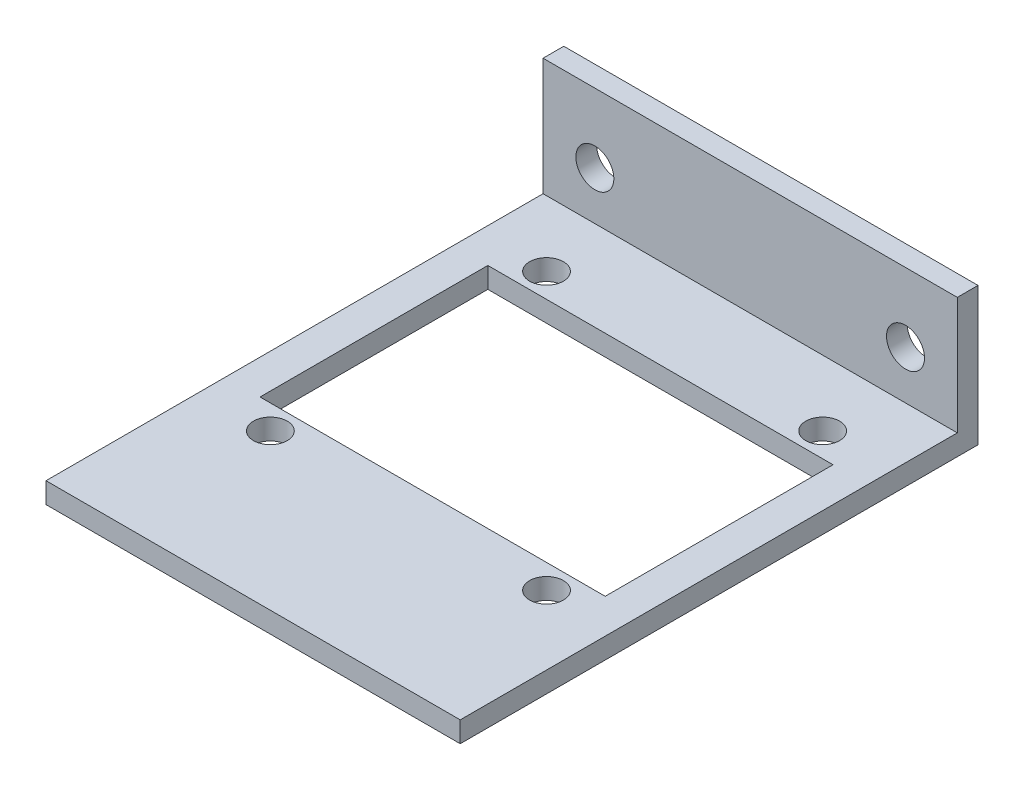
ISO-10303-21;
HEADER;
FILE_DESCRIPTION(('STEP AP214'),'2;1');
FILE_NAME('part.step','',(''),(''),'','','');
FILE_SCHEMA(('AUTOMOTIVE_DESIGN { 1 0 10303 214 1 1 1 1 }'));
ENDSEC;
DATA;
#1=APPLICATION_CONTEXT('core data for automotive mechanical design processes');
#2=APPLICATION_PROTOCOL_DEFINITION('international standard','automotive_design',2000,#1);
#3=PRODUCT_CONTEXT('',#1,'mechanical');
#4=PRODUCT('Part','Part','',(#3));
#5=PRODUCT_RELATED_PRODUCT_CATEGORY('part','',(#4));
#6=PRODUCT_DEFINITION_FORMATION('','',#4);
#7=PRODUCT_DEFINITION_CONTEXT('part definition',#1,'design');
#8=PRODUCT_DEFINITION('design','',#6,#7);
#9=PRODUCT_DEFINITION_SHAPE('','',#8);
#10=(LENGTH_UNIT() NAMED_UNIT(*) SI_UNIT(.MILLI.,.METRE.));
#11=(NAMED_UNIT(*) PLANE_ANGLE_UNIT() SI_UNIT($,.RADIAN.));
#12=(NAMED_UNIT(*) SI_UNIT($,.STERADIAN.) SOLID_ANGLE_UNIT());
#13=UNCERTAINTY_MEASURE_WITH_UNIT(LENGTH_MEASURE(1.E-05),#10,'distance_accuracy_value','');
#14=(GEOMETRIC_REPRESENTATION_CONTEXT(3) GLOBAL_UNCERTAINTY_ASSIGNED_CONTEXT((#13)) GLOBAL_UNIT_ASSIGNED_CONTEXT((#10,
#11,#12)) REPRESENTATION_CONTEXT('',''));
#15=CARTESIAN_POINT('',(0.,0.,0.));
#16=DIRECTION('',(0.,0.,1.));
#17=DIRECTION('',(1.,0.,0.));
#18=AXIS2_PLACEMENT_3D('',#15,#16,#17);
#19=CARTESIAN_POINT('',(-30.,3.,37.5));
#20=DIRECTION('',(0.,0.,-1.));
#21=DIRECTION('',(-1.,0.,0.));
#22=AXIS2_PLACEMENT_3D('',#19,#20,#21);
#23=PLANE('',#22);
#24=DIRECTION('',(1.,0.,0.));
#25=VECTOR('',#24,1.);
#26=CARTESIAN_POINT('',(-30.,0.,37.5));
#27=LINE('',#26,#25);
#28=CARTESIAN_POINT('',(-30.,0.,37.5));
#29=VERTEX_POINT('',#28);
#30=CARTESIAN_POINT('',(30.,0.,37.5));
#31=VERTEX_POINT('',#30);
#32=EDGE_CURVE('E177',#29,#31,#27,.T.);
#33=ORIENTED_EDGE('',*,*,#32,.T.);
#34=DIRECTION('',(0.,-1.,0.));
#35=VECTOR('',#34,1.);
#36=CARTESIAN_POINT('',(30.,3.,37.5));
#37=LINE('',#36,#35);
#38=CARTESIAN_POINT('',(30.,3.,37.5));
#39=VERTEX_POINT('',#38);
#40=EDGE_CURVE('E12',#39,#31,#37,.T.);
#41=ORIENTED_EDGE('',*,*,#40,.F.);
#42=DIRECTION('',(1.,0.,0.));
#43=VECTOR('',#42,1.);
#44=CARTESIAN_POINT('',(-30.,3.,37.5));
#45=LINE('',#44,#43);
#46=CARTESIAN_POINT('',(-30.,3.,37.5));
#47=VERTEX_POINT('',#46);
#48=EDGE_CURVE('E196',#47,#39,#45,.T.);
#49=ORIENTED_EDGE('',*,*,#48,.F.);
#50=DIRECTION('',(0.,-1.,0.));
#51=VECTOR('',#50,1.);
#52=CARTESIAN_POINT('',(-30.,3.,37.5));
#53=LINE('',#52,#51);
#54=EDGE_CURVE('E208',#47,#29,#53,.T.);
#55=ORIENTED_EDGE('',*,*,#54,.T.);
#56=EDGE_LOOP('',(#33,#41,#49,#55));
#57=FACE_BOUND('',#56,.T.);
#58=ADVANCED_FACE('F41',(#57),#23,.F.);
#59=CARTESIAN_POINT('',(30.,3.,37.5));
#60=DIRECTION('',(-1.,0.,0.));
#61=DIRECTION('',(0.,0.,1.));
#62=AXIS2_PLACEMENT_3D('',#59,#60,#61);
#63=PLANE('',#62);
#64=DIRECTION('',(0.,0.,-1.));
#65=VECTOR('',#64,1.);
#66=CARTESIAN_POINT('',(30.,0.,37.5));
#67=LINE('',#66,#65);
#68=CARTESIAN_POINT('',(30.,0.,-37.5));
#69=VERTEX_POINT('',#68);
#70=EDGE_CURVE('E212',#31,#69,#67,.T.);
#71=ORIENTED_EDGE('',*,*,#70,.T.);
#72=DIRECTION('',(0.,-1.,0.));
#73=VECTOR('',#72,1.);
#74=CARTESIAN_POINT('',(30.,3.,-37.5));
#75=LINE('',#74,#73);
#76=CARTESIAN_POINT('',(30.,20.,-37.5));
#77=VERTEX_POINT('',#76);
#78=EDGE_CURVE('E50',#77,#69,#75,.T.);
#79=ORIENTED_EDGE('',*,*,#78,.F.);
#80=DIRECTION('',(0.,0.,-1.));
#81=VECTOR('',#80,1.);
#82=CARTESIAN_POINT('',(30.,20.,-37.5));
#83=LINE('',#82,#81);
#84=CARTESIAN_POINT('',(30.,20.,-34.5));
#85=VERTEX_POINT('',#84);
#86=EDGE_CURVE('E173',#85,#77,#83,.T.);
#87=ORIENTED_EDGE('',*,*,#86,.F.);
#88=DIRECTION('',(0.,-1.,0.));
#89=VECTOR('',#88,1.);
#90=CARTESIAN_POINT('',(30.,100.074953183502,-34.5));
#91=LINE('',#90,#89);
#92=CARTESIAN_POINT('',(30.,3.,-34.5));
#93=VERTEX_POINT('',#92);
#94=EDGE_CURVE('E172',#85,#93,#91,.T.);
#95=ORIENTED_EDGE('',*,*,#94,.T.);
#96=DIRECTION('',(0.,0.,-1.));
#97=VECTOR('',#96,1.);
#98=CARTESIAN_POINT('',(30.,3.,37.5));
#99=LINE('',#98,#97);
#100=EDGE_CURVE('E200',#39,#93,#99,.T.);
#101=ORIENTED_EDGE('',*,*,#100,.F.);
#102=ORIENTED_EDGE('',*,*,#40,.T.);
#103=EDGE_LOOP('',(#71,#79,#87,#95,#101,#102));
#104=FACE_BOUND('',#103,.T.);
#105=ADVANCED_FACE('F300',(#104),#63,.F.);
#106=CARTESIAN_POINT('',(-30.,3.,-37.5));
#107=DIRECTION('',(0.,0.,-1.));
#108=DIRECTION('',(-1.,0.,0.));
#109=AXIS2_PLACEMENT_3D('',#106,#107,#108);
#110=PLANE('',#109);
#111=CARTESIAN_POINT('',(22.5,9.99999999999999,-37.5));
#112=DIRECTION('',(0.,0.,-1.));
#113=DIRECTION('',(-1.,0.,0.));
#114=AXIS2_PLACEMENT_3D('',#111,#112,#113);
#115=CIRCLE('',#114,2.75);
#116=CARTESIAN_POINT('',(19.75,9.99999999999999,-37.5));
#117=VERTEX_POINT('',#116);
#118=EDGE_CURVE('E247',#117,#117,#115,.T.);
#119=ORIENTED_EDGE('',*,*,#118,.F.);
#120=EDGE_LOOP('',(#119));
#121=FACE_BOUND('',#120,.T.);
#122=CARTESIAN_POINT('',(-22.5,9.99999999999999,-37.5));
#123=DIRECTION('',(0.,0.,-1.));
#124=DIRECTION('',(-1.,0.,0.));
#125=AXIS2_PLACEMENT_3D('',#122,#123,#124);
#126=CIRCLE('',#125,2.75);
#127=CARTESIAN_POINT('',(-25.25,9.99999999999999,-37.5));
#128=VERTEX_POINT('',#127);
#129=EDGE_CURVE('E233',#128,#128,#126,.T.);
#130=ORIENTED_EDGE('',*,*,#129,.F.);
#131=EDGE_LOOP('',(#130));
#132=FACE_BOUND('',#131,.T.);
#133=DIRECTION('',(1.,0.,0.));
#134=VECTOR('',#133,1.);
#135=CARTESIAN_POINT('',(-30.,0.,-37.5));
#136=LINE('',#135,#134);
#137=CARTESIAN_POINT('',(-30.,0.,-37.5));
#138=VERTEX_POINT('',#137);
#139=EDGE_CURVE('E216',#138,#69,#136,.T.);
#140=ORIENTED_EDGE('',*,*,#139,.F.);
#141=DIRECTION('',(0.,-1.,0.));
#142=VECTOR('',#141,1.);
#143=CARTESIAN_POINT('',(-30.,3.,-37.5));
#144=LINE('',#143,#142);
#145=CARTESIAN_POINT('',(-30.,20.,-37.5));
#146=VERTEX_POINT('',#145);
#147=EDGE_CURVE('E225',#146,#138,#144,.T.);
#148=ORIENTED_EDGE('',*,*,#147,.F.);
#149=DIRECTION('',(-1.,0.,0.));
#150=VECTOR('',#149,1.);
#151=CARTESIAN_POINT('',(-30.,20.,-37.5));
#152=LINE('',#151,#150);
#153=EDGE_CURVE('E186',#77,#146,#152,.T.);
#154=ORIENTED_EDGE('',*,*,#153,.F.);
#155=ORIENTED_EDGE('',*,*,#78,.T.);
#156=EDGE_LOOP('',(#140,#148,#154,#155));
#157=FACE_BOUND('',#156,.T.);
#158=ADVANCED_FACE('F305',(#121,#132,#157),#110,.T.);
#159=CARTESIAN_POINT('',(-30.,3.,37.5));
#160=DIRECTION('',(-1.,0.,0.));
#161=DIRECTION('',(0.,0.,1.));
#162=AXIS2_PLACEMENT_3D('',#159,#160,#161);
#163=PLANE('',#162);
#164=DIRECTION('',(0.,0.,-1.));
#165=VECTOR('',#164,1.);
#166=CARTESIAN_POINT('',(-30.,0.,37.5));
#167=LINE('',#166,#165);
#168=EDGE_CURVE('E201',#29,#138,#167,.T.);
#169=ORIENTED_EDGE('',*,*,#168,.F.);
#170=ORIENTED_EDGE('',*,*,#54,.F.);
#171=DIRECTION('',(0.,0.,-1.));
#172=VECTOR('',#171,1.);
#173=CARTESIAN_POINT('',(-30.,3.,37.5));
#174=LINE('',#173,#172);
#175=CARTESIAN_POINT('',(-30.,3.,-34.5));
#176=VERTEX_POINT('',#175);
#177=EDGE_CURVE('E204',#47,#176,#174,.T.);
#178=ORIENTED_EDGE('',*,*,#177,.T.);
#179=DIRECTION('',(0.,-1.,0.));
#180=VECTOR('',#179,1.);
#181=CARTESIAN_POINT('',(-30.,100.074953183502,-34.5));
#182=LINE('',#181,#180);
#183=CARTESIAN_POINT('',(-30.,20.,-34.5));
#184=VERTEX_POINT('',#183);
#185=EDGE_CURVE('E136',#184,#176,#182,.T.);
#186=ORIENTED_EDGE('',*,*,#185,.F.);
#187=DIRECTION('',(0.,0.,1.));
#188=VECTOR('',#187,1.);
#189=CARTESIAN_POINT('',(-30.,20.,-37.5));
#190=LINE('',#189,#188);
#191=EDGE_CURVE('E182',#146,#184,#190,.T.);
#192=ORIENTED_EDGE('',*,*,#191,.F.);
#193=ORIENTED_EDGE('',*,*,#147,.T.);
#194=EDGE_LOOP('',(#169,#170,#178,#186,#192,#193));
#195=FACE_BOUND('',#194,.T.);
#196=ADVANCED_FACE('F293',(#195),#163,.T.);
#197=CARTESIAN_POINT('',(0.,3.,0.));
#198=DIRECTION('',(0.,1.,0.));
#199=DIRECTION('',(0.,0.,1.));
#200=AXIS2_PLACEMENT_3D('',#197,#198,#199);
#201=PLANE('',#200);
#202=CARTESIAN_POINT('',(-20.,3.,15.));
#203=DIRECTION('',(0.,1.,0.));
#204=DIRECTION('',(0.,0.,1.));
#205=AXIS2_PLACEMENT_3D('',#202,#203,#204);
#206=CIRCLE('',#205,2.45);
#207=CARTESIAN_POINT('',(-20.,3.,17.45));
#208=VERTEX_POINT('',#207);
#209=EDGE_CURVE('E232',#208,#208,#206,.T.);
#210=ORIENTED_EDGE('',*,*,#209,.F.);
#211=EDGE_LOOP('',(#210));
#212=FACE_BOUND('',#211,.T.);
#213=CARTESIAN_POINT('',(20.,3.,15.));
#214=DIRECTION('',(0.,1.,0.));
#215=DIRECTION('',(0.,0.,1.));
#216=AXIS2_PLACEMENT_3D('',#213,#214,#215);
#217=CIRCLE('',#216,2.45);
#218=CARTESIAN_POINT('',(20.,3.,17.45));
#219=VERTEX_POINT('',#218);
#220=EDGE_CURVE('E260',#219,#219,#217,.T.);
#221=ORIENTED_EDGE('',*,*,#220,.F.);
#222=EDGE_LOOP('',(#221));
#223=FACE_BOUND('',#222,.T.);
#224=CARTESIAN_POINT('',(20.,3.,-25.));
#225=DIRECTION('',(0.,1.,0.));
#226=DIRECTION('',(0.,0.,1.));
#227=AXIS2_PLACEMENT_3D('',#224,#225,#226);
#228=CIRCLE('',#227,2.45);
#229=CARTESIAN_POINT('',(20.,3.,-22.55));
#230=VERTEX_POINT('',#229);
#231=EDGE_CURVE('E250',#230,#230,#228,.T.);
#232=ORIENTED_EDGE('',*,*,#231,.F.);
#233=EDGE_LOOP('',(#232));
#234=FACE_BOUND('',#233,.T.);
#235=CARTESIAN_POINT('',(-20.,3.,-25.));
#236=DIRECTION('',(0.,1.,0.));
#237=DIRECTION('',(0.,0.,1.));
#238=AXIS2_PLACEMENT_3D('',#235,#236,#237);
#239=CIRCLE('',#238,2.45);
#240=CARTESIAN_POINT('',(-20.,3.,-22.55));
#241=VERTEX_POINT('',#240);
#242=EDGE_CURVE('E259',#241,#241,#239,.T.);
#243=ORIENTED_EDGE('',*,*,#242,.F.);
#244=EDGE_LOOP('',(#243));
#245=FACE_BOUND('',#244,.T.);
#246=DIRECTION('',(0.,0.,-1.));
#247=VECTOR('',#246,1.);
#248=CARTESIAN_POINT('',(25.,3.,-21.5));
#249=LINE('',#248,#247);
#250=CARTESIAN_POINT('',(25.,3.,11.5));
#251=VERTEX_POINT('',#250);
#252=CARTESIAN_POINT('',(25.,3.,-21.5));
#253=VERTEX_POINT('',#252);
#254=EDGE_CURVE('E58',#251,#253,#249,.T.);
#255=ORIENTED_EDGE('',*,*,#254,.F.);
#256=DIRECTION('',(1.,0.,0.));
#257=VECTOR('',#256,1.);
#258=CARTESIAN_POINT('',(-25.,3.,11.5));
#259=LINE('',#258,#257);
#260=CARTESIAN_POINT('',(-25.,3.,11.5));
#261=VERTEX_POINT('',#260);
#262=EDGE_CURVE('E129',#261,#251,#259,.T.);
#263=ORIENTED_EDGE('',*,*,#262,.F.);
#264=DIRECTION('',(0.,0.,1.));
#265=VECTOR('',#264,1.);
#266=CARTESIAN_POINT('',(-25.,3.,-21.5));
#267=LINE('',#266,#265);
#268=CARTESIAN_POINT('',(-25.,3.,-21.5));
#269=VERTEX_POINT('',#268);
#270=EDGE_CURVE('E154',#269,#261,#267,.T.);
#271=ORIENTED_EDGE('',*,*,#270,.F.);
#272=DIRECTION('',(-1.,0.,0.));
#273=VECTOR('',#272,1.);
#274=CARTESIAN_POINT('',(-25.,3.,-21.5));
#275=LINE('',#274,#273);
#276=EDGE_CURVE('E147',#253,#269,#275,.T.);
#277=ORIENTED_EDGE('',*,*,#276,.F.);
#278=EDGE_LOOP('',(#255,#263,#271,#277));
#279=FACE_BOUND('',#278,.T.);
#280=DIRECTION('',(1.,0.,0.));
#281=VECTOR('',#280,1.);
#282=CARTESIAN_POINT('',(-30.,3.,-34.5));
#283=LINE('',#282,#281);
#284=EDGE_CURVE('E168',#176,#93,#283,.T.);
#285=ORIENTED_EDGE('',*,*,#284,.F.);
#286=ORIENTED_EDGE('',*,*,#177,.F.);
#287=ORIENTED_EDGE('',*,*,#48,.T.);
#288=ORIENTED_EDGE('',*,*,#100,.T.);
#289=EDGE_LOOP('',(#285,#286,#287,#288));
#290=FACE_BOUND('',#289,.T.);
#291=ADVANCED_FACE('F283',(#212,#223,#234,#245,#279,#290),#201,.T.);
#292=CARTESIAN_POINT('',(0.,0.,0.));
#293=DIRECTION('',(0.,1.,0.));
#294=DIRECTION('',(0.,0.,1.));
#295=AXIS2_PLACEMENT_3D('',#292,#293,#294);
#296=PLANE('',#295);
#297=CARTESIAN_POINT('',(-20.,0.,15.));
#298=DIRECTION('',(0.,1.,0.));
#299=DIRECTION('',(0.,0.,1.));
#300=AXIS2_PLACEMENT_3D('',#297,#298,#299);
#301=CIRCLE('',#300,2.45);
#302=CARTESIAN_POINT('',(-20.,0.,17.45));
#303=VERTEX_POINT('',#302);
#304=EDGE_CURVE('E239',#303,#303,#301,.F.);
#305=ORIENTED_EDGE('',*,*,#304,.F.);
#306=EDGE_LOOP('',(#305));
#307=FACE_BOUND('',#306,.T.);
#308=CARTESIAN_POINT('',(20.,0.,15.));
#309=DIRECTION('',(0.,1.,0.));
#310=DIRECTION('',(0.,0.,1.));
#311=AXIS2_PLACEMENT_3D('',#308,#309,#310);
#312=CIRCLE('',#311,2.45);
#313=CARTESIAN_POINT('',(20.,0.,17.45));
#314=VERTEX_POINT('',#313);
#315=EDGE_CURVE('E255',#314,#314,#312,.F.);
#316=ORIENTED_EDGE('',*,*,#315,.F.);
#317=EDGE_LOOP('',(#316));
#318=FACE_BOUND('',#317,.T.);
#319=CARTESIAN_POINT('',(20.,0.,-25.));
#320=DIRECTION('',(0.,1.,0.));
#321=DIRECTION('',(0.,0.,1.));
#322=AXIS2_PLACEMENT_3D('',#319,#320,#321);
#323=CIRCLE('',#322,2.45);
#324=CARTESIAN_POINT('',(20.,0.,-22.55));
#325=VERTEX_POINT('',#324);
#326=EDGE_CURVE('E254',#325,#325,#323,.F.);
#327=ORIENTED_EDGE('',*,*,#326,.F.);
#328=EDGE_LOOP('',(#327));
#329=FACE_BOUND('',#328,.T.);
#330=CARTESIAN_POINT('',(-20.,0.,-25.));
#331=DIRECTION('',(0.,1.,0.));
#332=DIRECTION('',(0.,0.,1.));
#333=AXIS2_PLACEMENT_3D('',#330,#331,#332);
#334=CIRCLE('',#333,2.45);
#335=CARTESIAN_POINT('',(-20.,0.,-22.55));
#336=VERTEX_POINT('',#335);
#337=EDGE_CURVE('E273',#336,#336,#334,.F.);
#338=ORIENTED_EDGE('',*,*,#337,.F.);
#339=EDGE_LOOP('',(#338));
#340=FACE_BOUND('',#339,.T.);
#341=DIRECTION('',(-1.,0.,0.));
#342=VECTOR('',#341,1.);
#343=CARTESIAN_POINT('',(-25.,0.,11.5));
#344=LINE('',#343,#342);
#345=CARTESIAN_POINT('',(25.,0.,11.5));
#346=VERTEX_POINT('',#345);
#347=CARTESIAN_POINT('',(-25.,0.,11.5));
#348=VERTEX_POINT('',#347);
#349=EDGE_CURVE('E142',#346,#348,#344,.T.);
#350=ORIENTED_EDGE('',*,*,#349,.F.);
#351=DIRECTION('',(0.,0.,1.));
#352=VECTOR('',#351,1.);
#353=CARTESIAN_POINT('',(25.,0.,-21.5));
#354=LINE('',#353,#352);
#355=CARTESIAN_POINT('',(25.,0.,-21.5));
#356=VERTEX_POINT('',#355);
#357=EDGE_CURVE('E122',#356,#346,#354,.T.);
#358=ORIENTED_EDGE('',*,*,#357,.F.);
#359=DIRECTION('',(1.,0.,0.));
#360=VECTOR('',#359,1.);
#361=CARTESIAN_POINT('',(-25.,0.,-21.5));
#362=LINE('',#361,#360);
#363=CARTESIAN_POINT('',(-25.,0.,-21.5));
#364=VERTEX_POINT('',#363);
#365=EDGE_CURVE('E132',#364,#356,#362,.T.);
#366=ORIENTED_EDGE('',*,*,#365,.F.);
#367=DIRECTION('',(0.,0.,-1.));
#368=VECTOR('',#367,1.);
#369=CARTESIAN_POINT('',(-25.,0.,-21.5));
#370=LINE('',#369,#368);
#371=EDGE_CURVE('E66',#348,#364,#370,.T.);
#372=ORIENTED_EDGE('',*,*,#371,.F.);
#373=EDGE_LOOP('',(#350,#358,#366,#372));
#374=FACE_BOUND('',#373,.T.);
#375=ORIENTED_EDGE('',*,*,#32,.F.);
#376=ORIENTED_EDGE('',*,*,#168,.T.);
#377=ORIENTED_EDGE('',*,*,#139,.T.);
#378=ORIENTED_EDGE('',*,*,#70,.F.);
#379=EDGE_LOOP('',(#375,#376,#377,#378));
#380=FACE_BOUND('',#379,.T.);
#381=ADVANCED_FACE('F139',(#307,#318,#329,#340,#374,#380),#296,.F.);
#382=CARTESIAN_POINT('',(-30.,100.074953183502,-34.5));
#383=DIRECTION('',(0.,0.,-1.));
#384=DIRECTION('',(-1.,0.,0.));
#385=AXIS2_PLACEMENT_3D('',#382,#383,#384);
#386=PLANE('',#385);
#387=CARTESIAN_POINT('',(22.5,9.99999999999999,-34.5));
#388=DIRECTION('',(0.,0.,-1.));
#389=DIRECTION('',(-1.,0.,0.));
#390=AXIS2_PLACEMENT_3D('',#387,#388,#389);
#391=CIRCLE('',#390,2.75);
#392=CARTESIAN_POINT('',(19.75,9.99999999999999,-34.5));
#393=VERTEX_POINT('',#392);
#394=EDGE_CURVE('E44',#393,#393,#391,.T.);
#395=ORIENTED_EDGE('',*,*,#394,.T.);
#396=EDGE_LOOP('',(#395));
#397=FACE_BOUND('',#396,.T.);
#398=CARTESIAN_POINT('',(-22.5,9.99999999999999,-34.5));
#399=DIRECTION('',(0.,0.,-1.));
#400=DIRECTION('',(-1.,0.,0.));
#401=AXIS2_PLACEMENT_3D('',#398,#399,#400);
#402=CIRCLE('',#401,2.75);
#403=CARTESIAN_POINT('',(-25.25,9.99999999999999,-34.5));
#404=VERTEX_POINT('',#403);
#405=EDGE_CURVE('E229',#404,#404,#402,.T.);
#406=ORIENTED_EDGE('',*,*,#405,.T.);
#407=EDGE_LOOP('',(#406));
#408=FACE_BOUND('',#407,.T.);
#409=DIRECTION('',(1.,0.,0.));
#410=VECTOR('',#409,1.);
#411=CARTESIAN_POINT('',(-30.,20.,-34.5));
#412=LINE('',#411,#410);
#413=EDGE_CURVE('E178',#184,#85,#412,.T.);
#414=ORIENTED_EDGE('',*,*,#413,.F.);
#415=ORIENTED_EDGE('',*,*,#185,.T.);
#416=ORIENTED_EDGE('',*,*,#284,.T.);
#417=ORIENTED_EDGE('',*,*,#94,.F.);
#418=EDGE_LOOP('',(#414,#415,#416,#417));
#419=FACE_BOUND('',#418,.T.);
#420=ADVANCED_FACE('F282',(#397,#408,#419),#386,.F.);
#421=CARTESIAN_POINT('',(0.,20.,0.));
#422=DIRECTION('',(0.,1.,0.));
#423=DIRECTION('',(0.,0.,1.));
#424=AXIS2_PLACEMENT_3D('',#421,#422,#423);
#425=PLANE('',#424);
#426=ORIENTED_EDGE('',*,*,#153,.T.);
#427=ORIENTED_EDGE('',*,*,#191,.T.);
#428=ORIENTED_EDGE('',*,*,#413,.T.);
#429=ORIENTED_EDGE('',*,*,#86,.T.);
#430=EDGE_LOOP('',(#426,#427,#428,#429));
#431=FACE_BOUND('',#430,.T.);
#432=ADVANCED_FACE('F290',(#431),#425,.T.);
#433=CARTESIAN_POINT('',(25.,-0.00100000000000013,-21.5));
#434=DIRECTION('',(1.,0.,0.));
#435=DIRECTION('',(0.,0.,-1.));
#436=AXIS2_PLACEMENT_3D('',#433,#434,#435);
#437=PLANE('',#436);
#438=ORIENTED_EDGE('',*,*,#357,.T.);
#439=DIRECTION('',(0.,1.,0.));
#440=VECTOR('',#439,1.);
#441=CARTESIAN_POINT('',(25.,-0.00100000000000013,11.5));
#442=LINE('',#441,#440);
#443=EDGE_CURVE('E137',#346,#251,#442,.T.);
#444=ORIENTED_EDGE('',*,*,#443,.T.);
#445=ORIENTED_EDGE('',*,*,#254,.T.);
#446=DIRECTION('',(0.,1.,0.));
#447=VECTOR('',#446,1.);
#448=CARTESIAN_POINT('',(25.,-0.00100000000000013,-21.5));
#449=LINE('',#448,#447);
#450=EDGE_CURVE('E118',#356,#253,#449,.T.);
#451=ORIENTED_EDGE('',*,*,#450,.F.);
#452=EDGE_LOOP('',(#438,#444,#445,#451));
#453=FACE_BOUND('',#452,.T.);
#454=ADVANCED_FACE('F120',(#453),#437,.F.);
#455=CARTESIAN_POINT('',(-25.,-0.00100000000000013,11.5));
#456=DIRECTION('',(0.,0.,1.));
#457=DIRECTION('',(1.,0.,0.));
#458=AXIS2_PLACEMENT_3D('',#455,#456,#457);
#459=PLANE('',#458);
#460=ORIENTED_EDGE('',*,*,#349,.T.);
#461=DIRECTION('',(0.,1.,0.));
#462=VECTOR('',#461,1.);
#463=CARTESIAN_POINT('',(-25.,-0.00100000000000013,11.5));
#464=LINE('',#463,#462);
#465=EDGE_CURVE('E163',#348,#261,#464,.T.);
#466=ORIENTED_EDGE('',*,*,#465,.T.);
#467=ORIENTED_EDGE('',*,*,#262,.T.);
#468=ORIENTED_EDGE('',*,*,#443,.F.);
#469=EDGE_LOOP('',(#460,#466,#467,#468));
#470=FACE_BOUND('',#469,.T.);
#471=ADVANCED_FACE('F327',(#470),#459,.F.);
#472=CARTESIAN_POINT('',(-25.,-0.00100000000000013,-21.5));
#473=DIRECTION('',(-1.,0.,0.));
#474=DIRECTION('',(0.,0.,1.));
#475=AXIS2_PLACEMENT_3D('',#472,#473,#474);
#476=PLANE('',#475);
#477=ORIENTED_EDGE('',*,*,#371,.T.);
#478=DIRECTION('',(0.,1.,0.));
#479=VECTOR('',#478,1.);
#480=CARTESIAN_POINT('',(-25.,-0.00100000000000013,-21.5));
#481=LINE('',#480,#479);
#482=EDGE_CURVE('E128',#364,#269,#481,.T.);
#483=ORIENTED_EDGE('',*,*,#482,.T.);
#484=ORIENTED_EDGE('',*,*,#270,.T.);
#485=ORIENTED_EDGE('',*,*,#465,.F.);
#486=EDGE_LOOP('',(#477,#483,#484,#485));
#487=FACE_BOUND('',#486,.T.);
#488=ADVANCED_FACE('F332',(#487),#476,.F.);
#489=CARTESIAN_POINT('',(-25.,-0.00100000000000013,-21.5));
#490=DIRECTION('',(0.,0.,-1.));
#491=DIRECTION('',(-1.,0.,0.));
#492=AXIS2_PLACEMENT_3D('',#489,#490,#491);
#493=PLANE('',#492);
#494=ORIENTED_EDGE('',*,*,#365,.T.);
#495=ORIENTED_EDGE('',*,*,#450,.T.);
#496=ORIENTED_EDGE('',*,*,#276,.T.);
#497=ORIENTED_EDGE('',*,*,#482,.F.);
#498=EDGE_LOOP('',(#494,#495,#496,#497));
#499=FACE_BOUND('',#498,.T.);
#500=ADVANCED_FACE('F133',(#499),#493,.F.);
#501=CARTESIAN_POINT('',(-20.,-0.00100000000000013,-25.));
#502=DIRECTION('',(0.,1.,0.));
#503=DIRECTION('',(0.,0.,1.));
#504=AXIS2_PLACEMENT_3D('',#501,#502,#503);
#505=CYLINDRICAL_SURFACE('',#504,2.45);
#506=CARTESIAN_POINT('',(-20.,3.,-22.55));
#507=CARTESIAN_POINT('',(-20.,2.96875,-22.55));
#508=CARTESIAN_POINT('',(-20.,2.9375,-22.55));
#509=CARTESIAN_POINT('',(-20.,2.875,-22.55));
#510=CARTESIAN_POINT('',(-20.,2.84375,-22.55));
#511=CARTESIAN_POINT('',(-20.,2.78125,-22.55));
#512=CARTESIAN_POINT('',(-20.,2.75,-22.55));
#513=CARTESIAN_POINT('',(-20.,2.6875,-22.55));
#514=CARTESIAN_POINT('',(-20.,2.65625,-22.55));
#515=CARTESIAN_POINT('',(-20.,2.59375,-22.55));
#516=CARTESIAN_POINT('',(-20.,2.5625,-22.55));
#517=CARTESIAN_POINT('',(-20.,2.5,-22.55));
#518=CARTESIAN_POINT('',(-20.,2.46875,-22.55));
#519=CARTESIAN_POINT('',(-20.,2.40625,-22.55));
#520=CARTESIAN_POINT('',(-20.,2.375,-22.55));
#521=CARTESIAN_POINT('',(-20.,2.3125,-22.55));
#522=CARTESIAN_POINT('',(-20.,2.28125,-22.55));
#523=CARTESIAN_POINT('',(-20.,2.21875,-22.55));
#524=CARTESIAN_POINT('',(-20.,2.1875,-22.55));
#525=CARTESIAN_POINT('',(-20.,2.125,-22.55));
#526=CARTESIAN_POINT('',(-20.,2.09375,-22.55));
#527=CARTESIAN_POINT('',(-20.,2.03125,-22.55));
#528=CARTESIAN_POINT('',(-20.,2.,-22.55));
#529=CARTESIAN_POINT('',(-20.,1.9375,-22.55));
#530=CARTESIAN_POINT('',(-20.,1.90625,-22.55));
#531=CARTESIAN_POINT('',(-20.,1.84375,-22.55));
#532=CARTESIAN_POINT('',(-20.,1.8125,-22.55));
#533=CARTESIAN_POINT('',(-20.,1.75,-22.55));
#534=CARTESIAN_POINT('',(-20.,1.71875,-22.55));
#535=CARTESIAN_POINT('',(-20.,1.65625,-22.55));
#536=CARTESIAN_POINT('',(-20.,1.625,-22.55));
#537=CARTESIAN_POINT('',(-20.,1.5625,-22.55));
#538=CARTESIAN_POINT('',(-20.,1.53125,-22.55));
#539=CARTESIAN_POINT('',(-20.,1.46875,-22.55));
#540=CARTESIAN_POINT('',(-20.,1.4375,-22.55));
#541=CARTESIAN_POINT('',(-20.,1.375,-22.55));
#542=CARTESIAN_POINT('',(-20.,1.34375,-22.55));
#543=CARTESIAN_POINT('',(-20.,1.28125,-22.55));
#544=CARTESIAN_POINT('',(-20.,1.25,-22.55));
#545=CARTESIAN_POINT('',(-20.,1.1875,-22.55));
#546=CARTESIAN_POINT('',(-20.,1.15625,-22.55));
#547=CARTESIAN_POINT('',(-20.,1.09375,-22.55));
#548=CARTESIAN_POINT('',(-20.,1.0625,-22.55));
#549=CARTESIAN_POINT('',(-20.,1.,-22.55));
#550=CARTESIAN_POINT('',(-20.,0.96875,-22.55));
#551=CARTESIAN_POINT('',(-20.,0.90625,-22.55));
#552=CARTESIAN_POINT('',(-20.,0.875,-22.55));
#553=CARTESIAN_POINT('',(-20.,0.8125,-22.55));
#554=CARTESIAN_POINT('',(-20.,0.78125,-22.55));
#555=CARTESIAN_POINT('',(-20.,0.71875,-22.55));
#556=CARTESIAN_POINT('',(-20.,0.6875,-22.55));
#557=CARTESIAN_POINT('',(-20.,0.625,-22.55));
#558=CARTESIAN_POINT('',(-20.,0.59375,-22.55));
#559=CARTESIAN_POINT('',(-20.,0.53125,-22.55));
#560=CARTESIAN_POINT('',(-20.,0.5,-22.55));
#561=CARTESIAN_POINT('',(-20.,0.4375,-22.55));
#562=CARTESIAN_POINT('',(-20.,0.40625,-22.55));
#563=CARTESIAN_POINT('',(-20.,0.34375,-22.55));
#564=CARTESIAN_POINT('',(-20.,0.3125,-22.55));
#565=CARTESIAN_POINT('',(-20.,0.25,-22.55));
#566=CARTESIAN_POINT('',(-20.,0.21875,-22.55));
#567=CARTESIAN_POINT('',(-20.,0.15625,-22.55));
#568=CARTESIAN_POINT('',(-20.,0.125,-22.55));
#569=CARTESIAN_POINT('',(-20.,0.0625000000000001,-22.55));
#570=CARTESIAN_POINT('',(-20.,0.0312500000000001,-22.55));
#571=CARTESIAN_POINT('',(-20.,0.,-22.55));
#572=B_SPLINE_CURVE_WITH_KNOTS('',3,(#506,#507,#508,#509,#510,#511,#512,#513,#514,#515,#516,
#517,#518,#519,#520,#521,#522,#523,#524,#525,#526,#527,#528,#529,#530,#531,#532,#533,#534,#535,
#536,#537,#538,#539,#540,#541,#542,#543,#544,#545,#546,#547,#548,#549,#550,#551,#552,#553,#554,
#555,#556,#557,#558,#559,#560,#561,#562,#563,#564,#565,#566,#567,#568,#569,#570,#571),
.UNSPECIFIED.,.F.,.F.,(4,2,2,2,2,2,2,2,2,2,2,2,2,2,2,2,2,2,2,2,2,2,2,2,2,2,2,2,2,2,2,2,4),(0.,
0.0937500000000001,0.1875,0.28125,0.375,0.46875,0.5625,0.65625,0.75,0.84375,0.9375,1.03125,
1.125,1.21875,1.3125,1.40625,1.5,1.59375,1.6875,1.78125,1.875,1.96875,2.0625,2.15625,2.25,
2.34375,2.4375,2.53125,2.625,2.71875,2.8125,2.90625,3.),.UNSPECIFIED.);
#573=EDGE_CURVE('BSEAM279',#241,#336,#572,.T.);
#574=ORIENTED_EDGE('',*,*,#242,.T.);
#575=ORIENTED_EDGE('',*,*,#337,.T.);
#576=ORIENTED_EDGE('',*,*,#573,.T.);
#577=ORIENTED_EDGE('',*,*,#573,.F.);
#578=EDGE_LOOP('',(#574,#576,#575,#577));
#579=FACE_BOUND('',#578,.T.);
#580=ADVANCED_FACE('F279',(#579),#505,.F.);
#581=CARTESIAN_POINT('',(20.,-0.00100000000000013,-25.));
#582=DIRECTION('',(0.,1.,0.));
#583=DIRECTION('',(0.,0.,1.));
#584=AXIS2_PLACEMENT_3D('',#581,#582,#583);
#585=CYLINDRICAL_SURFACE('',#584,2.45);
#586=CARTESIAN_POINT('',(20.,3.,-22.55));
#587=CARTESIAN_POINT('',(20.,2.96875,-22.55));
#588=CARTESIAN_POINT('',(20.,2.9375,-22.55));
#589=CARTESIAN_POINT('',(20.,2.875,-22.55));
#590=CARTESIAN_POINT('',(20.,2.84375,-22.55));
#591=CARTESIAN_POINT('',(20.,2.78125,-22.55));
#592=CARTESIAN_POINT('',(20.,2.75,-22.55));
#593=CARTESIAN_POINT('',(20.,2.6875,-22.55));
#594=CARTESIAN_POINT('',(20.,2.65625,-22.55));
#595=CARTESIAN_POINT('',(20.,2.59375,-22.55));
#596=CARTESIAN_POINT('',(20.,2.5625,-22.55));
#597=CARTESIAN_POINT('',(20.,2.5,-22.55));
#598=CARTESIAN_POINT('',(20.,2.46875,-22.55));
#599=CARTESIAN_POINT('',(20.,2.40625,-22.55));
#600=CARTESIAN_POINT('',(20.,2.375,-22.55));
#601=CARTESIAN_POINT('',(20.,2.3125,-22.55));
#602=CARTESIAN_POINT('',(20.,2.28125,-22.55));
#603=CARTESIAN_POINT('',(20.,2.21875,-22.55));
#604=CARTESIAN_POINT('',(20.,2.1875,-22.55));
#605=CARTESIAN_POINT('',(20.,2.125,-22.55));
#606=CARTESIAN_POINT('',(20.,2.09375,-22.55));
#607=CARTESIAN_POINT('',(20.,2.03125,-22.55));
#608=CARTESIAN_POINT('',(20.,2.,-22.55));
#609=CARTESIAN_POINT('',(20.,1.9375,-22.55));
#610=CARTESIAN_POINT('',(20.,1.90625,-22.55));
#611=CARTESIAN_POINT('',(20.,1.84375,-22.55));
#612=CARTESIAN_POINT('',(20.,1.8125,-22.55));
#613=CARTESIAN_POINT('',(20.,1.75,-22.55));
#614=CARTESIAN_POINT('',(20.,1.71875,-22.55));
#615=CARTESIAN_POINT('',(20.,1.65625,-22.55));
#616=CARTESIAN_POINT('',(20.,1.625,-22.55));
#617=CARTESIAN_POINT('',(20.,1.5625,-22.55));
#618=CARTESIAN_POINT('',(20.,1.53125,-22.55));
#619=CARTESIAN_POINT('',(20.,1.46875,-22.55));
#620=CARTESIAN_POINT('',(20.,1.4375,-22.55));
#621=CARTESIAN_POINT('',(20.,1.375,-22.55));
#622=CARTESIAN_POINT('',(20.,1.34375,-22.55));
#623=CARTESIAN_POINT('',(20.,1.28125,-22.55));
#624=CARTESIAN_POINT('',(20.,1.25,-22.55));
#625=CARTESIAN_POINT('',(20.,1.1875,-22.55));
#626=CARTESIAN_POINT('',(20.,1.15625,-22.55));
#627=CARTESIAN_POINT('',(20.,1.09375,-22.55));
#628=CARTESIAN_POINT('',(20.,1.0625,-22.55));
#629=CARTESIAN_POINT('',(20.,1.,-22.55));
#630=CARTESIAN_POINT('',(20.,0.96875,-22.55));
#631=CARTESIAN_POINT('',(20.,0.90625,-22.55));
#632=CARTESIAN_POINT('',(20.,0.875,-22.55));
#633=CARTESIAN_POINT('',(20.,0.8125,-22.55));
#634=CARTESIAN_POINT('',(20.,0.78125,-22.55));
#635=CARTESIAN_POINT('',(20.,0.71875,-22.55));
#636=CARTESIAN_POINT('',(20.,0.6875,-22.55));
#637=CARTESIAN_POINT('',(20.,0.625,-22.55));
#638=CARTESIAN_POINT('',(20.,0.59375,-22.55));
#639=CARTESIAN_POINT('',(20.,0.53125,-22.55));
#640=CARTESIAN_POINT('',(20.,0.5,-22.55));
#641=CARTESIAN_POINT('',(20.,0.4375,-22.55));
#642=CARTESIAN_POINT('',(20.,0.40625,-22.55));
#643=CARTESIAN_POINT('',(20.,0.34375,-22.55));
#644=CARTESIAN_POINT('',(20.,0.3125,-22.55));
#645=CARTESIAN_POINT('',(20.,0.25,-22.55));
#646=CARTESIAN_POINT('',(20.,0.21875,-22.55));
#647=CARTESIAN_POINT('',(20.,0.15625,-22.55));
#648=CARTESIAN_POINT('',(20.,0.125,-22.55));
#649=CARTESIAN_POINT('',(20.,0.0625000000000001,-22.55));
#650=CARTESIAN_POINT('',(20.,0.0312500000000001,-22.55));
#651=CARTESIAN_POINT('',(20.,0.,-22.55));
#652=B_SPLINE_CURVE_WITH_KNOTS('',3,(#586,#587,#588,#589,#590,#591,#592,#593,#594,#595,#596,
#597,#598,#599,#600,#601,#602,#603,#604,#605,#606,#607,#608,#609,#610,#611,#612,#613,#614,#615,
#616,#617,#618,#619,#620,#621,#622,#623,#624,#625,#626,#627,#628,#629,#630,#631,#632,#633,#634,
#635,#636,#637,#638,#639,#640,#641,#642,#643,#644,#645,#646,#647,#648,#649,#650,#651),
.UNSPECIFIED.,.F.,.F.,(4,2,2,2,2,2,2,2,2,2,2,2,2,2,2,2,2,2,2,2,2,2,2,2,2,2,2,2,2,2,2,2,4),(0.,
0.0937500000000001,0.1875,0.28125,0.375,0.46875,0.5625,0.65625,0.75,0.84375,0.9375,1.03125,
1.125,1.21875,1.3125,1.40625,1.5,1.59375,1.6875,1.78125,1.875,1.96875,2.0625,2.15625,2.25,
2.34375,2.4375,2.53125,2.625,2.71875,2.8125,2.90625,3.),.UNSPECIFIED.);
#653=EDGE_CURVE('BSEAM340',#230,#325,#652,.T.);
#654=ORIENTED_EDGE('',*,*,#231,.T.);
#655=ORIENTED_EDGE('',*,*,#326,.T.);
#656=ORIENTED_EDGE('',*,*,#653,.T.);
#657=ORIENTED_EDGE('',*,*,#653,.F.);
#658=EDGE_LOOP('',(#654,#656,#655,#657));
#659=FACE_BOUND('',#658,.T.);
#660=ADVANCED_FACE('F340',(#659),#585,.F.);
#661=CARTESIAN_POINT('',(20.,-0.00100000000000013,15.));
#662=DIRECTION('',(0.,1.,0.));
#663=DIRECTION('',(0.,0.,1.));
#664=AXIS2_PLACEMENT_3D('',#661,#662,#663);
#665=CYLINDRICAL_SURFACE('',#664,2.45);
#666=CARTESIAN_POINT('',(20.,3.,17.45));
#667=CARTESIAN_POINT('',(20.,2.96875,17.45));
#668=CARTESIAN_POINT('',(20.,2.9375,17.45));
#669=CARTESIAN_POINT('',(20.,2.875,17.45));
#670=CARTESIAN_POINT('',(20.,2.84375,17.45));
#671=CARTESIAN_POINT('',(20.,2.78125,17.45));
#672=CARTESIAN_POINT('',(20.,2.75,17.45));
#673=CARTESIAN_POINT('',(20.,2.6875,17.45));
#674=CARTESIAN_POINT('',(20.,2.65625,17.45));
#675=CARTESIAN_POINT('',(20.,2.59375,17.45));
#676=CARTESIAN_POINT('',(20.,2.5625,17.45));
#677=CARTESIAN_POINT('',(20.,2.5,17.45));
#678=CARTESIAN_POINT('',(20.,2.46875,17.45));
#679=CARTESIAN_POINT('',(20.,2.40625,17.45));
#680=CARTESIAN_POINT('',(20.,2.375,17.45));
#681=CARTESIAN_POINT('',(20.,2.3125,17.45));
#682=CARTESIAN_POINT('',(20.,2.28125,17.45));
#683=CARTESIAN_POINT('',(20.,2.21875,17.45));
#684=CARTESIAN_POINT('',(20.,2.1875,17.45));
#685=CARTESIAN_POINT('',(20.,2.125,17.45));
#686=CARTESIAN_POINT('',(20.,2.09375,17.45));
#687=CARTESIAN_POINT('',(20.,2.03125,17.45));
#688=CARTESIAN_POINT('',(20.,2.,17.45));
#689=CARTESIAN_POINT('',(20.,1.9375,17.45));
#690=CARTESIAN_POINT('',(20.,1.90625,17.45));
#691=CARTESIAN_POINT('',(20.,1.84375,17.45));
#692=CARTESIAN_POINT('',(20.,1.8125,17.45));
#693=CARTESIAN_POINT('',(20.,1.75,17.45));
#694=CARTESIAN_POINT('',(20.,1.71875,17.45));
#695=CARTESIAN_POINT('',(20.,1.65625,17.45));
#696=CARTESIAN_POINT('',(20.,1.625,17.45));
#697=CARTESIAN_POINT('',(20.,1.5625,17.45));
#698=CARTESIAN_POINT('',(20.,1.53125,17.45));
#699=CARTESIAN_POINT('',(20.,1.46875,17.45));
#700=CARTESIAN_POINT('',(20.,1.4375,17.45));
#701=CARTESIAN_POINT('',(20.,1.375,17.45));
#702=CARTESIAN_POINT('',(20.,1.34375,17.45));
#703=CARTESIAN_POINT('',(20.,1.28125,17.45));
#704=CARTESIAN_POINT('',(20.,1.25,17.45));
#705=CARTESIAN_POINT('',(20.,1.1875,17.45));
#706=CARTESIAN_POINT('',(20.,1.15625,17.45));
#707=CARTESIAN_POINT('',(20.,1.09375,17.45));
#708=CARTESIAN_POINT('',(20.,1.0625,17.45));
#709=CARTESIAN_POINT('',(20.,1.,17.45));
#710=CARTESIAN_POINT('',(20.,0.96875,17.45));
#711=CARTESIAN_POINT('',(20.,0.90625,17.45));
#712=CARTESIAN_POINT('',(20.,0.875,17.45));
#713=CARTESIAN_POINT('',(20.,0.8125,17.45));
#714=CARTESIAN_POINT('',(20.,0.78125,17.45));
#715=CARTESIAN_POINT('',(20.,0.71875,17.45));
#716=CARTESIAN_POINT('',(20.,0.6875,17.45));
#717=CARTESIAN_POINT('',(20.,0.625,17.45));
#718=CARTESIAN_POINT('',(20.,0.59375,17.45));
#719=CARTESIAN_POINT('',(20.,0.53125,17.45));
#720=CARTESIAN_POINT('',(20.,0.5,17.45));
#721=CARTESIAN_POINT('',(20.,0.4375,17.45));
#722=CARTESIAN_POINT('',(20.,0.40625,17.45));
#723=CARTESIAN_POINT('',(20.,0.34375,17.45));
#724=CARTESIAN_POINT('',(20.,0.3125,17.45));
#725=CARTESIAN_POINT('',(20.,0.25,17.45));
#726=CARTESIAN_POINT('',(20.,0.21875,17.45));
#727=CARTESIAN_POINT('',(20.,0.15625,17.45));
#728=CARTESIAN_POINT('',(20.,0.125,17.45));
#729=CARTESIAN_POINT('',(20.,0.0625000000000001,17.45));
#730=CARTESIAN_POINT('',(20.,0.0312500000000001,17.45));
#731=CARTESIAN_POINT('',(20.,0.,17.45));
#732=B_SPLINE_CURVE_WITH_KNOTS('',3,(#666,#667,#668,#669,#670,#671,#672,#673,#674,#675,#676,
#677,#678,#679,#680,#681,#682,#683,#684,#685,#686,#687,#688,#689,#690,#691,#692,#693,#694,#695,
#696,#697,#698,#699,#700,#701,#702,#703,#704,#705,#706,#707,#708,#709,#710,#711,#712,#713,#714,
#715,#716,#717,#718,#719,#720,#721,#722,#723,#724,#725,#726,#727,#728,#729,#730,#731),
.UNSPECIFIED.,.F.,.F.,(4,2,2,2,2,2,2,2,2,2,2,2,2,2,2,2,2,2,2,2,2,2,2,2,2,2,2,2,2,2,2,2,4),(0.,
0.0937500000000001,0.1875,0.28125,0.375,0.46875,0.5625,0.65625,0.75,0.84375,0.9375,1.03125,
1.125,1.21875,1.3125,1.40625,1.5,1.59375,1.6875,1.78125,1.875,1.96875,2.0625,2.15625,2.25,
2.34375,2.4375,2.53125,2.625,2.71875,2.8125,2.90625,3.),.UNSPECIFIED.);
#733=EDGE_CURVE('BSEAM346',#219,#314,#732,.T.);
#734=ORIENTED_EDGE('',*,*,#220,.T.);
#735=ORIENTED_EDGE('',*,*,#315,.T.);
#736=ORIENTED_EDGE('',*,*,#733,.T.);
#737=ORIENTED_EDGE('',*,*,#733,.F.);
#738=EDGE_LOOP('',(#734,#736,#735,#737));
#739=FACE_BOUND('',#738,.T.);
#740=ADVANCED_FACE('F346',(#739),#665,.F.);
#741=CARTESIAN_POINT('',(-20.,-0.00100000000000013,15.));
#742=DIRECTION('',(0.,1.,0.));
#743=DIRECTION('',(0.,0.,1.));
#744=AXIS2_PLACEMENT_3D('',#741,#742,#743);
#745=CYLINDRICAL_SURFACE('',#744,2.45);
#746=CARTESIAN_POINT('',(-20.,3.,17.45));
#747=CARTESIAN_POINT('',(-20.,2.96875,17.45));
#748=CARTESIAN_POINT('',(-20.,2.9375,17.45));
#749=CARTESIAN_POINT('',(-20.,2.875,17.45));
#750=CARTESIAN_POINT('',(-20.,2.84375,17.45));
#751=CARTESIAN_POINT('',(-20.,2.78125,17.45));
#752=CARTESIAN_POINT('',(-20.,2.75,17.45));
#753=CARTESIAN_POINT('',(-20.,2.6875,17.45));
#754=CARTESIAN_POINT('',(-20.,2.65625,17.45));
#755=CARTESIAN_POINT('',(-20.,2.59375,17.45));
#756=CARTESIAN_POINT('',(-20.,2.5625,17.45));
#757=CARTESIAN_POINT('',(-20.,2.5,17.45));
#758=CARTESIAN_POINT('',(-20.,2.46875,17.45));
#759=CARTESIAN_POINT('',(-20.,2.40625,17.45));
#760=CARTESIAN_POINT('',(-20.,2.375,17.45));
#761=CARTESIAN_POINT('',(-20.,2.3125,17.45));
#762=CARTESIAN_POINT('',(-20.,2.28125,17.45));
#763=CARTESIAN_POINT('',(-20.,2.21875,17.45));
#764=CARTESIAN_POINT('',(-20.,2.1875,17.45));
#765=CARTESIAN_POINT('',(-20.,2.125,17.45));
#766=CARTESIAN_POINT('',(-20.,2.09375,17.45));
#767=CARTESIAN_POINT('',(-20.,2.03125,17.45));
#768=CARTESIAN_POINT('',(-20.,2.,17.45));
#769=CARTESIAN_POINT('',(-20.,1.9375,17.45));
#770=CARTESIAN_POINT('',(-20.,1.90625,17.45));
#771=CARTESIAN_POINT('',(-20.,1.84375,17.45));
#772=CARTESIAN_POINT('',(-20.,1.8125,17.45));
#773=CARTESIAN_POINT('',(-20.,1.75,17.45));
#774=CARTESIAN_POINT('',(-20.,1.71875,17.45));
#775=CARTESIAN_POINT('',(-20.,1.65625,17.45));
#776=CARTESIAN_POINT('',(-20.,1.625,17.45));
#777=CARTESIAN_POINT('',(-20.,1.5625,17.45));
#778=CARTESIAN_POINT('',(-20.,1.53125,17.45));
#779=CARTESIAN_POINT('',(-20.,1.46875,17.45));
#780=CARTESIAN_POINT('',(-20.,1.4375,17.45));
#781=CARTESIAN_POINT('',(-20.,1.375,17.45));
#782=CARTESIAN_POINT('',(-20.,1.34375,17.45));
#783=CARTESIAN_POINT('',(-20.,1.28125,17.45));
#784=CARTESIAN_POINT('',(-20.,1.25,17.45));
#785=CARTESIAN_POINT('',(-20.,1.1875,17.45));
#786=CARTESIAN_POINT('',(-20.,1.15625,17.45));
#787=CARTESIAN_POINT('',(-20.,1.09375,17.45));
#788=CARTESIAN_POINT('',(-20.,1.0625,17.45));
#789=CARTESIAN_POINT('',(-20.,1.,17.45));
#790=CARTESIAN_POINT('',(-20.,0.96875,17.45));
#791=CARTESIAN_POINT('',(-20.,0.90625,17.45));
#792=CARTESIAN_POINT('',(-20.,0.875,17.45));
#793=CARTESIAN_POINT('',(-20.,0.8125,17.45));
#794=CARTESIAN_POINT('',(-20.,0.78125,17.45));
#795=CARTESIAN_POINT('',(-20.,0.71875,17.45));
#796=CARTESIAN_POINT('',(-20.,0.6875,17.45));
#797=CARTESIAN_POINT('',(-20.,0.625,17.45));
#798=CARTESIAN_POINT('',(-20.,0.59375,17.45));
#799=CARTESIAN_POINT('',(-20.,0.53125,17.45));
#800=CARTESIAN_POINT('',(-20.,0.5,17.45));
#801=CARTESIAN_POINT('',(-20.,0.4375,17.45));
#802=CARTESIAN_POINT('',(-20.,0.40625,17.45));
#803=CARTESIAN_POINT('',(-20.,0.34375,17.45));
#804=CARTESIAN_POINT('',(-20.,0.3125,17.45));
#805=CARTESIAN_POINT('',(-20.,0.25,17.45));
#806=CARTESIAN_POINT('',(-20.,0.21875,17.45));
#807=CARTESIAN_POINT('',(-20.,0.15625,17.45));
#808=CARTESIAN_POINT('',(-20.,0.125,17.45));
#809=CARTESIAN_POINT('',(-20.,0.0625000000000001,17.45));
#810=CARTESIAN_POINT('',(-20.,0.0312500000000001,17.45));
#811=CARTESIAN_POINT('',(-20.,0.,17.45));
#812=B_SPLINE_CURVE_WITH_KNOTS('',3,(#746,#747,#748,#749,#750,#751,#752,#753,#754,#755,#756,
#757,#758,#759,#760,#761,#762,#763,#764,#765,#766,#767,#768,#769,#770,#771,#772,#773,#774,#775,
#776,#777,#778,#779,#780,#781,#782,#783,#784,#785,#786,#787,#788,#789,#790,#791,#792,#793,#794,
#795,#796,#797,#798,#799,#800,#801,#802,#803,#804,#805,#806,#807,#808,#809,#810,#811),
.UNSPECIFIED.,.F.,.F.,(4,2,2,2,2,2,2,2,2,2,2,2,2,2,2,2,2,2,2,2,2,2,2,2,2,2,2,2,2,2,2,2,4),(0.,
0.0937500000000001,0.1875,0.28125,0.375,0.46875,0.5625,0.65625,0.75,0.84375,0.9375,1.03125,
1.125,1.21875,1.3125,1.40625,1.5,1.59375,1.6875,1.78125,1.875,1.96875,2.0625,2.15625,2.25,
2.34375,2.4375,2.53125,2.625,2.71875,2.8125,2.90625,3.),.UNSPECIFIED.);
#813=EDGE_CURVE('BSEAM342',#208,#303,#812,.T.);
#814=ORIENTED_EDGE('',*,*,#209,.T.);
#815=ORIENTED_EDGE('',*,*,#304,.T.);
#816=ORIENTED_EDGE('',*,*,#813,.T.);
#817=ORIENTED_EDGE('',*,*,#813,.F.);
#818=EDGE_LOOP('',(#814,#816,#815,#817));
#819=FACE_BOUND('',#818,.T.);
#820=ADVANCED_FACE('F342',(#819),#745,.F.);
#821=CARTESIAN_POINT('',(-22.5,9.99999999999999,-37.5));
#822=DIRECTION('',(0.,0.,-1.));
#823=DIRECTION('',(-1.,0.,0.));
#824=AXIS2_PLACEMENT_3D('',#821,#822,#823);
#825=CYLINDRICAL_SURFACE('',#824,2.75);
#826=ORIENTED_EDGE('',*,*,#129,.T.);
#827=EDGE_LOOP('',(#826));
#828=FACE_BOUND('',#827,.T.);
#829=ORIENTED_EDGE('',*,*,#405,.F.);
#830=EDGE_LOOP('',(#829));
#831=FACE_BOUND('',#830,.T.);
#832=ADVANCED_FACE('F345',(#828,#831),#825,.F.);
#833=CARTESIAN_POINT('',(22.5,9.99999999999999,-37.5));
#834=DIRECTION('',(0.,0.,-1.));
#835=DIRECTION('',(-1.,0.,0.));
#836=AXIS2_PLACEMENT_3D('',#833,#834,#835);
#837=CYLINDRICAL_SURFACE('',#836,2.75);
#838=ORIENTED_EDGE('',*,*,#118,.T.);
#839=EDGE_LOOP('',(#838));
#840=FACE_BOUND('',#839,.T.);
#841=ORIENTED_EDGE('',*,*,#394,.F.);
#842=EDGE_LOOP('',(#841));
#843=FACE_BOUND('',#842,.T.);
#844=ADVANCED_FACE('F356',(#840,#843),#837,.F.);
#845=CLOSED_SHELL('',(#58,#105,#158,#196,#291,#381,#420,#432,#454,#471,#488,#500,#580,#660,#740,
#820,#832,#844));
#846=MANIFOLD_SOLID_BREP('B2',#845);
#847=ADVANCED_BREP_SHAPE_REPRESENTATION('',(#18,#846),#14);
#848=SHAPE_DEFINITION_REPRESENTATION(#9,#847);
ENDSEC;
END-ISO-10303-21;
